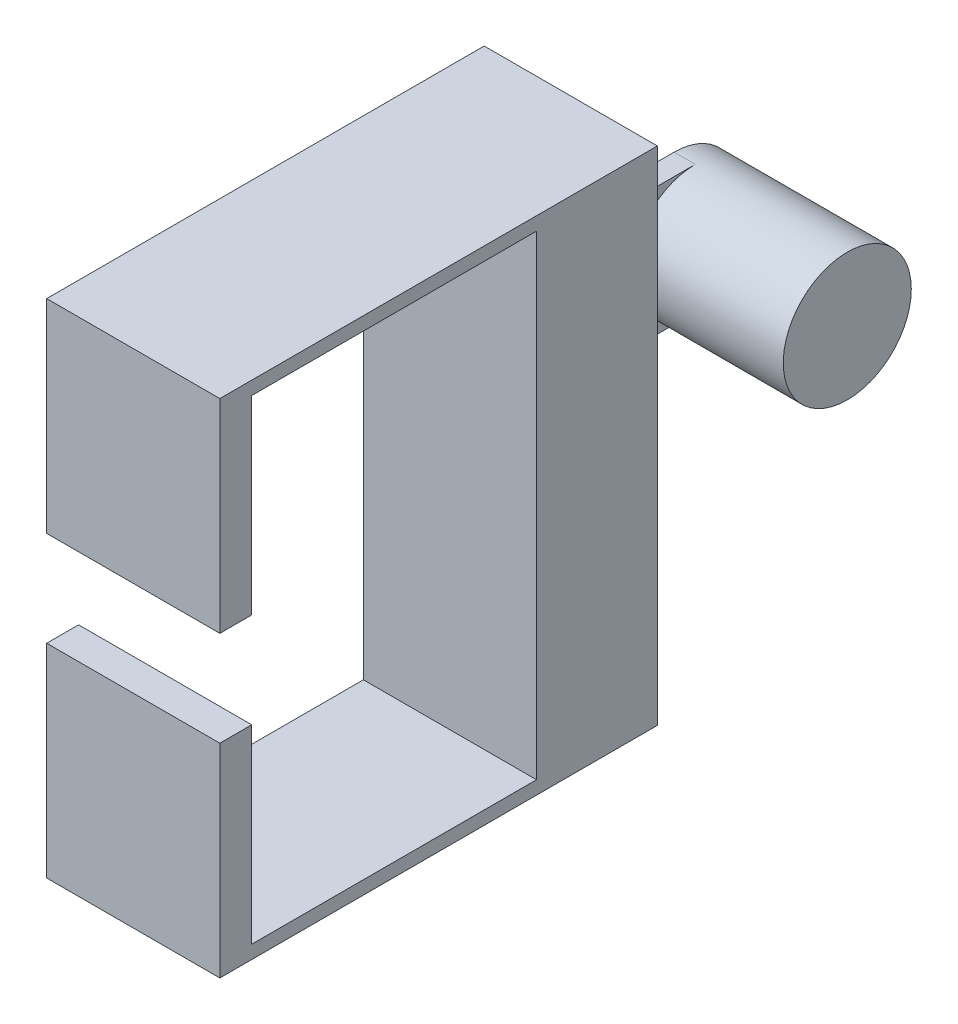
ISO-10303-21;
HEADER;
FILE_DESCRIPTION(('STEP AP214'),'2;1');
FILE_NAME('part.step','',(''),(''),'','','');
FILE_SCHEMA(('AUTOMOTIVE_DESIGN { 1 0 10303 214 1 1 1 1 }'));
ENDSEC;
DATA;
#1=APPLICATION_CONTEXT('core data for automotive mechanical design processes');
#2=APPLICATION_PROTOCOL_DEFINITION('international standard','automotive_design',2000,#1);
#3=PRODUCT_CONTEXT('',#1,'mechanical');
#4=PRODUCT('Part','Part','',(#3));
#5=PRODUCT_RELATED_PRODUCT_CATEGORY('part','',(#4));
#6=PRODUCT_DEFINITION_FORMATION('','',#4);
#7=PRODUCT_DEFINITION_CONTEXT('part definition',#1,'design');
#8=PRODUCT_DEFINITION('design','',#6,#7);
#9=PRODUCT_DEFINITION_SHAPE('','',#8);
#10=(LENGTH_UNIT() NAMED_UNIT(*) SI_UNIT(.MILLI.,.METRE.));
#11=(NAMED_UNIT(*) PLANE_ANGLE_UNIT() SI_UNIT($,.RADIAN.));
#12=(NAMED_UNIT(*) SI_UNIT($,.STERADIAN.) SOLID_ANGLE_UNIT());
#13=UNCERTAINTY_MEASURE_WITH_UNIT(LENGTH_MEASURE(1.E-05),#10,'distance_accuracy_value','');
#14=(GEOMETRIC_REPRESENTATION_CONTEXT(3) GLOBAL_UNCERTAINTY_ASSIGNED_CONTEXT((#13)) GLOBAL_UNIT_ASSIGNED_CONTEXT((#10,
#11,#12)) REPRESENTATION_CONTEXT('',''));
#15=CARTESIAN_POINT('',(0.,0.,0.));
#16=DIRECTION('',(0.,0.,1.));
#17=DIRECTION('',(1.,0.,0.));
#18=AXIS2_PLACEMENT_3D('',#15,#16,#17);
#19=CARTESIAN_POINT('',(20.32,0.,0.));
#20=DIRECTION('',(-1.,0.,0.));
#21=DIRECTION('',(0.,0.,1.));
#22=AXIS2_PLACEMENT_3D('',#19,#20,#21);
#23=CYLINDRICAL_SURFACE('',#22,8.56234917061049);
#24=CARTESIAN_POINT('',(20.32,0.,0.));
#25=DIRECTION('',(1.,0.,0.));
#26=DIRECTION('',(0.,0.,-1.));
#27=AXIS2_PLACEMENT_3D('',#24,#25,#26);
#28=CIRCLE('',#27,8.56234917061049);
#29=CARTESIAN_POINT('',(20.32,0.,-8.56234917061049));
#30=VERTEX_POINT('',#29);
#31=EDGE_CURVE('E14',#30,#30,#28,.T.);
#32=ORIENTED_EDGE('',*,*,#31,.F.);
#33=EDGE_LOOP('',(#32));
#34=FACE_BOUND('',#33,.T.);
#35=CARTESIAN_POINT('',(0.,0.,0.));
#36=DIRECTION('',(1.,0.,0.));
#37=DIRECTION('',(0.,0.,-1.));
#38=AXIS2_PLACEMENT_3D('',#35,#36,#37);
#39=CIRCLE('',#38,8.56234917061049);
#40=CARTESIAN_POINT('',(0.,8.56234917061049,0.));
#41=VERTEX_POINT('',#40);
#42=CARTESIAN_POINT('',(0.,-8.56234917061049,0.));
#43=VERTEX_POINT('',#42);
#44=EDGE_CURVE('E119',#41,#43,#39,.T.);
#45=ORIENTED_EDGE('',*,*,#44,.T.);
#46=DIRECTION('',(1.,0.,0.));
#47=VECTOR('',#46,1.);
#48=CARTESIAN_POINT('',(-2.83368809650338,-8.56234917061049,0.));
#49=LINE('',#48,#47);
#50=CARTESIAN_POINT('',(-2.83368809650338,-8.56234917061049,0.));
#51=VERTEX_POINT('',#50);
#52=EDGE_CURVE('E137',#51,#43,#49,.T.);
#53=ORIENTED_EDGE('',*,*,#52,.F.);
#54=CARTESIAN_POINT('',(-2.83368809650338,0.,0.));
#55=DIRECTION('',(1.,0.,0.));
#56=DIRECTION('',(0.,0.,-1.));
#57=AXIS2_PLACEMENT_3D('',#54,#55,#56);
#58=CIRCLE('',#57,8.56234917061049);
#59=CARTESIAN_POINT('',(-2.83368809650338,8.56234917061049,0.));
#60=VERTEX_POINT('',#59);
#61=EDGE_CURVE('E378',#51,#60,#58,.T.);
#62=ORIENTED_EDGE('',*,*,#61,.T.);
#63=DIRECTION('',(1.,0.,0.));
#64=VECTOR('',#63,1.);
#65=CARTESIAN_POINT('',(-2.83368809650338,8.56234917061049,0.));
#66=LINE('',#65,#64);
#67=EDGE_CURVE('E390',#60,#41,#66,.T.);
#68=ORIENTED_EDGE('',*,*,#67,.T.);
#69=EDGE_LOOP('',(#45,#53,#62,#68));
#70=FACE_BOUND('',#69,.T.);
#71=ADVANCED_FACE('F118',(#34,#70),#23,.T.);
#72=CARTESIAN_POINT('',(20.32,0.,0.));
#73=DIRECTION('',(1.,0.,0.));
#74=DIRECTION('',(0.,0.,-1.));
#75=AXIS2_PLACEMENT_3D('',#72,#73,#74);
#76=PLANE('',#75);
#77=ORIENTED_EDGE('',*,*,#31,.T.);
#78=EDGE_LOOP('',(#77));
#79=FACE_BOUND('',#78,.T.);
#80=ADVANCED_FACE('F514',(#79),#76,.T.);
#81=CARTESIAN_POINT('',(0.,0.,0.));
#82=DIRECTION('',(1.,0.,0.));
#83=DIRECTION('',(0.,0.,-1.));
#84=AXIS2_PLACEMENT_3D('',#81,#82,#83);
#85=PLANE('',#84);
#86=ORIENTED_EDGE('',*,*,#44,.F.);
#87=DIRECTION('',(0.,0.,-1.));
#88=VECTOR('',#87,1.);
#89=CARTESIAN_POINT('',(0.,8.56234917061049,0.));
#90=LINE('',#89,#88);
#91=CARTESIAN_POINT('',(0.,8.56234917061049,25.4));
#92=VERTEX_POINT('',#91);
#93=EDGE_CURVE('E133',#92,#41,#90,.T.);
#94=ORIENTED_EDGE('',*,*,#93,.F.);
#95=DIRECTION('',(0.,1.,0.));
#96=VECTOR('',#95,1.);
#97=CARTESIAN_POINT('',(0.,0.,25.4));
#98=LINE('',#97,#96);
#99=CARTESIAN_POINT('',(0.,-8.56234917061049,25.4));
#100=VERTEX_POINT('',#99);
#101=EDGE_CURVE('E388',#100,#92,#98,.T.);
#102=ORIENTED_EDGE('',*,*,#101,.F.);
#103=DIRECTION('',(0.,0.,-1.));
#104=VECTOR('',#103,1.);
#105=CARTESIAN_POINT('',(0.,-8.56234917061049,0.));
#106=LINE('',#105,#104);
#107=EDGE_CURVE('E381',#100,#43,#106,.T.);
#108=ORIENTED_EDGE('',*,*,#107,.T.);
#109=EDGE_LOOP('',(#86,#94,#102,#108));
#110=FACE_BOUND('',#109,.T.);
#111=ADVANCED_FACE('F409',(#110),#85,.T.);
#112=CARTESIAN_POINT('',(-2.83368809650338,-8.56234917061049,0.));
#113=DIRECTION('',(0.,-1.,0.));
#114=DIRECTION('',(0.,0.,-1.));
#115=AXIS2_PLACEMENT_3D('',#112,#113,#114);
#116=PLANE('',#115);
#117=ORIENTED_EDGE('',*,*,#107,.F.);
#118=DIRECTION('',(1.,0.,0.));
#119=VECTOR('',#118,1.);
#120=CARTESIAN_POINT('',(-2.83368809650338,-8.56234917061049,25.4));
#121=LINE('',#120,#119);
#122=CARTESIAN_POINT('',(-2.83368809650338,-8.56234917061049,25.4));
#123=VERTEX_POINT('',#122);
#124=EDGE_CURVE('E400',#123,#100,#121,.T.);
#125=ORIENTED_EDGE('',*,*,#124,.F.);
#126=DIRECTION('',(0.,0.,-1.));
#127=VECTOR('',#126,1.);
#128=CARTESIAN_POINT('',(-2.83368809650338,-8.56234917061049,0.));
#129=LINE('',#128,#127);
#130=EDGE_CURVE('E383',#123,#51,#129,.T.);
#131=ORIENTED_EDGE('',*,*,#130,.T.);
#132=ORIENTED_EDGE('',*,*,#52,.T.);
#133=EDGE_LOOP('',(#117,#125,#131,#132));
#134=FACE_BOUND('',#133,.T.);
#135=ADVANCED_FACE('F417',(#134),#116,.T.);
#136=CARTESIAN_POINT('',(-2.83368809650338,8.56234917061049,0.));
#137=DIRECTION('',(0.,-1.,0.));
#138=DIRECTION('',(0.,0.,-1.));
#139=AXIS2_PLACEMENT_3D('',#136,#137,#138);
#140=PLANE('',#139);
#141=ORIENTED_EDGE('',*,*,#93,.T.);
#142=ORIENTED_EDGE('',*,*,#67,.F.);
#143=DIRECTION('',(0.,0.,-1.));
#144=VECTOR('',#143,1.);
#145=CARTESIAN_POINT('',(-2.83368809650338,8.56234917061049,0.));
#146=LINE('',#145,#144);
#147=CARTESIAN_POINT('',(-2.83368809650338,8.56234917061049,25.4));
#148=VERTEX_POINT('',#147);
#149=EDGE_CURVE('E159',#148,#60,#146,.T.);
#150=ORIENTED_EDGE('',*,*,#149,.F.);
#151=DIRECTION('',(1.,0.,0.));
#152=VECTOR('',#151,1.);
#153=CARTESIAN_POINT('',(-2.83368809650338,8.56234917061049,25.4));
#154=LINE('',#153,#152);
#155=EDGE_CURVE('E405',#148,#92,#154,.T.);
#156=ORIENTED_EDGE('',*,*,#155,.T.);
#157=EDGE_LOOP('',(#141,#142,#150,#156));
#158=FACE_BOUND('',#157,.T.);
#159=ADVANCED_FACE('F528',(#158),#140,.F.);
#160=CARTESIAN_POINT('',(-2.83368809650338,0.,0.));
#161=DIRECTION('',(1.,0.,0.));
#162=DIRECTION('',(0.,0.,-1.));
#163=AXIS2_PLACEMENT_3D('',#160,#161,#162);
#164=PLANE('',#163);
#165=ORIENTED_EDGE('',*,*,#61,.F.);
#166=ORIENTED_EDGE('',*,*,#130,.F.);
#167=DIRECTION('',(0.,1.,0.));
#168=VECTOR('',#167,1.);
#169=CARTESIAN_POINT('',(-2.83368809650338,0.,25.4));
#170=LINE('',#169,#168);
#171=CARTESIAN_POINT('',(-2.83368809650338,-33.5541911532378,25.4));
#172=VERTEX_POINT('',#171);
#173=EDGE_CURVE('E302',#172,#123,#170,.T.);
#174=ORIENTED_EDGE('',*,*,#173,.F.);
#175=DIRECTION('',(0.,0.,-1.));
#176=VECTOR('',#175,1.);
#177=CARTESIAN_POINT('',(-2.83368809650338,-33.5541911532378,0.));
#178=LINE('',#177,#176);
#179=CARTESIAN_POINT('',(-2.83368809650338,-33.5541911532378,83.9097482997454));
#180=VERTEX_POINT('',#179);
#181=EDGE_CURVE('E248',#180,#172,#178,.T.);
#182=ORIENTED_EDGE('',*,*,#181,.F.);
#183=DIRECTION('',(0.,-1.,0.));
#184=VECTOR('',#183,1.);
#185=CARTESIAN_POINT('',(-2.83368809650338,0.,83.9097482997454));
#186=LINE('',#185,#184);
#187=CARTESIAN_POINT('',(-2.83368809650338,-6.36016,83.9097482997454));
#188=VERTEX_POINT('',#187);
#189=EDGE_CURVE('E339',#188,#180,#186,.T.);
#190=ORIENTED_EDGE('',*,*,#189,.F.);
#191=DIRECTION('',(0.,0.,-1.));
#192=VECTOR('',#191,1.);
#193=CARTESIAN_POINT('',(-2.83368809650338,-6.36015999999998,0.));
#194=LINE('',#193,#192);
#195=CARTESIAN_POINT('',(-2.83368809650338,-6.36016,79.6448861376298));
#196=VERTEX_POINT('',#195);
#197=EDGE_CURVE('E338',#188,#196,#194,.T.);
#198=ORIENTED_EDGE('',*,*,#197,.T.);
#199=DIRECTION('',(0.,-1.,0.));
#200=VECTOR('',#199,1.);
#201=CARTESIAN_POINT('',(-2.83368809650338,0.,79.6448861376298));
#202=LINE('',#201,#200);
#203=CARTESIAN_POINT('',(-2.83368809650338,-31.77032,79.6448861376298));
#204=VERTEX_POINT('',#203);
#205=EDGE_CURVE('E334',#196,#204,#202,.T.);
#206=ORIENTED_EDGE('',*,*,#205,.T.);
#207=DIRECTION('',(0.,0.,-1.));
#208=VECTOR('',#207,1.);
#209=CARTESIAN_POINT('',(-2.83368809650338,-31.77032,0.));
#210=LINE('',#209,#208);
#211=CARTESIAN_POINT('',(-2.83368809650338,-31.77032,41.5575861376298));
#212=VERTEX_POINT('',#211);
#213=EDGE_CURVE('E329',#204,#212,#210,.T.);
#214=ORIENTED_EDGE('',*,*,#213,.T.);
#215=DIRECTION('',(0.,1.,0.));
#216=VECTOR('',#215,1.);
#217=CARTESIAN_POINT('',(-2.83368809650338,0.,41.5575861376298));
#218=LINE('',#217,#216);
#219=CARTESIAN_POINT('',(-2.83368809650338,31.77032,41.5575861376298));
#220=VERTEX_POINT('',#219);
#221=EDGE_CURVE('E330',#212,#220,#218,.T.);
#222=ORIENTED_EDGE('',*,*,#221,.T.);
#223=DIRECTION('',(0.,0.,-1.));
#224=VECTOR('',#223,1.);
#225=CARTESIAN_POINT('',(-2.83368809650338,31.77032,0.));
#226=LINE('',#225,#224);
#227=CARTESIAN_POINT('',(-2.83368809650338,31.77032,79.6448861376298));
#228=VERTEX_POINT('',#227);
#229=EDGE_CURVE('E323',#228,#220,#226,.T.);
#230=ORIENTED_EDGE('',*,*,#229,.F.);
#231=DIRECTION('',(0.,1.,0.));
#232=VECTOR('',#231,1.);
#233=CARTESIAN_POINT('',(-2.83368809650338,0.,79.6448861376298));
#234=LINE('',#233,#232);
#235=CARTESIAN_POINT('',(-2.83368809650338,6.36016,79.6448861376298));
#236=VERTEX_POINT('',#235);
#237=EDGE_CURVE('E317',#236,#228,#234,.T.);
#238=ORIENTED_EDGE('',*,*,#237,.F.);
#239=DIRECTION('',(0.,0.,-1.));
#240=VECTOR('',#239,1.);
#241=CARTESIAN_POINT('',(-2.83368809650338,6.36015999999998,0.));
#242=LINE('',#241,#240);
#243=CARTESIAN_POINT('',(-2.83368809650338,6.36016,83.9097482997454));
#244=VERTEX_POINT('',#243);
#245=EDGE_CURVE('E312',#244,#236,#242,.T.);
#246=ORIENTED_EDGE('',*,*,#245,.F.);
#247=DIRECTION('',(0.,1.,0.));
#248=VECTOR('',#247,1.);
#249=CARTESIAN_POINT('',(-2.83368809650338,0.,83.9097482997454));
#250=LINE('',#249,#248);
#251=CARTESIAN_POINT('',(-2.83368809650338,33.5541911532378,83.9097482997454));
#252=VERTEX_POINT('',#251);
#253=EDGE_CURVE('E315',#244,#252,#250,.T.);
#254=ORIENTED_EDGE('',*,*,#253,.T.);
#255=DIRECTION('',(0.,0.,-1.));
#256=VECTOR('',#255,1.);
#257=CARTESIAN_POINT('',(-2.83368809650338,33.5541911532378,0.));
#258=LINE('',#257,#256);
#259=CARTESIAN_POINT('',(-2.83368809650338,33.5541911532378,25.4));
#260=VERTEX_POINT('',#259);
#261=EDGE_CURVE('E310',#252,#260,#258,.T.);
#262=ORIENTED_EDGE('',*,*,#261,.T.);
#263=EDGE_CURVE('E245',#148,#260,#170,.T.);
#264=ORIENTED_EDGE('',*,*,#263,.F.);
#265=ORIENTED_EDGE('',*,*,#149,.T.);
#266=EDGE_LOOP('',(#165,#166,#174,#182,#190,#198,#206,#214,#222,#230,#238,#246,#254,#262,#264,#265));
#267=FACE_BOUND('',#266,.T.);
#268=ADVANCED_FACE('F419',(#267),#164,.F.);
#269=CARTESIAN_POINT('',(-2.83368809650338,0.,25.4));
#270=DIRECTION('',(0.,0.,-1.));
#271=DIRECTION('',(0.,1.,0.));
#272=AXIS2_PLACEMENT_3D('',#269,#270,#271);
#273=PLANE('',#272);
#274=ORIENTED_EDGE('',*,*,#155,.F.);
#275=ORIENTED_EDGE('',*,*,#263,.T.);
#276=DIRECTION('',(1.,0.,0.));
#277=VECTOR('',#276,1.);
#278=CARTESIAN_POINT('',(-2.83368809650338,33.5541911532378,25.4));
#279=LINE('',#278,#277);
#280=CARTESIAN_POINT('',(20.32,33.5541911532378,25.4));
#281=VERTEX_POINT('',#280);
#282=EDGE_CURVE('E240',#260,#281,#279,.T.);
#283=ORIENTED_EDGE('',*,*,#282,.T.);
#284=DIRECTION('',(0.,1.,0.));
#285=VECTOR('',#284,1.);
#286=CARTESIAN_POINT('',(20.32,0.,25.4));
#287=LINE('',#286,#285);
#288=CARTESIAN_POINT('',(20.32,-33.5541911532378,25.4));
#289=VERTEX_POINT('',#288);
#290=EDGE_CURVE('E243',#289,#281,#287,.T.);
#291=ORIENTED_EDGE('',*,*,#290,.F.);
#292=DIRECTION('',(1.,0.,0.));
#293=VECTOR('',#292,1.);
#294=CARTESIAN_POINT('',(-2.83368809650338,-33.5541911532378,25.4));
#295=LINE('',#294,#293);
#296=EDGE_CURVE('E347',#172,#289,#295,.T.);
#297=ORIENTED_EDGE('',*,*,#296,.F.);
#298=ORIENTED_EDGE('',*,*,#173,.T.);
#299=ORIENTED_EDGE('',*,*,#124,.T.);
#300=ORIENTED_EDGE('',*,*,#101,.T.);
#301=EDGE_LOOP('',(#274,#275,#283,#291,#297,#298,#299,#300));
#302=FACE_BOUND('',#301,.T.);
#303=ADVANCED_FACE('F238',(#302),#273,.T.);
#304=CARTESIAN_POINT('',(-2.83368809650338,-33.5541911532378,0.));
#305=DIRECTION('',(0.,-1.,0.));
#306=DIRECTION('',(0.,0.,-1.));
#307=AXIS2_PLACEMENT_3D('',#304,#305,#306);
#308=PLANE('',#307);
#309=ORIENTED_EDGE('',*,*,#296,.T.);
#310=DIRECTION('',(0.,0.,-1.));
#311=VECTOR('',#310,1.);
#312=CARTESIAN_POINT('',(20.32,-33.5541911532378,0.));
#313=LINE('',#312,#311);
#314=CARTESIAN_POINT('',(20.32,-33.5541911532378,83.9097482997454));
#315=VERTEX_POINT('',#314);
#316=EDGE_CURVE('E257',#315,#289,#313,.T.);
#317=ORIENTED_EDGE('',*,*,#316,.F.);
#318=DIRECTION('',(1.,0.,0.));
#319=VECTOR('',#318,1.);
#320=CARTESIAN_POINT('',(-2.83368809650338,-33.5541911532378,83.9097482997454));
#321=LINE('',#320,#319);
#322=EDGE_CURVE('E349',#180,#315,#321,.T.);
#323=ORIENTED_EDGE('',*,*,#322,.F.);
#324=ORIENTED_EDGE('',*,*,#181,.T.);
#325=EDGE_LOOP('',(#309,#317,#323,#324));
#326=FACE_BOUND('',#325,.T.);
#327=ADVANCED_FACE('F421',(#326),#308,.T.);
#328=CARTESIAN_POINT('',(-2.83368809650338,0.,83.9097482997454));
#329=DIRECTION('',(0.,0.,1.));
#330=DIRECTION('',(1.,0.,0.));
#331=AXIS2_PLACEMENT_3D('',#328,#329,#330);
#332=PLANE('',#331);
#333=ORIENTED_EDGE('',*,*,#322,.T.);
#334=DIRECTION('',(0.,-1.,0.));
#335=VECTOR('',#334,1.);
#336=CARTESIAN_POINT('',(20.32,0.,83.9097482997454));
#337=LINE('',#336,#335);
#338=CARTESIAN_POINT('',(20.32,-6.36016,83.9097482997454));
#339=VERTEX_POINT('',#338);
#340=EDGE_CURVE('E297',#339,#315,#337,.T.);
#341=ORIENTED_EDGE('',*,*,#340,.F.);
#342=DIRECTION('',(1.,0.,0.));
#343=VECTOR('',#342,1.);
#344=CARTESIAN_POINT('',(-2.83368809650338,-6.36016,83.9097482997454));
#345=LINE('',#344,#343);
#346=EDGE_CURVE('E355',#188,#339,#345,.T.);
#347=ORIENTED_EDGE('',*,*,#346,.F.);
#348=ORIENTED_EDGE('',*,*,#189,.T.);
#349=EDGE_LOOP('',(#333,#341,#347,#348));
#350=FACE_BOUND('',#349,.T.);
#351=ADVANCED_FACE('F428',(#350),#332,.T.);
#352=CARTESIAN_POINT('',(-2.83368809650338,-6.36015999999998,0.));
#353=DIRECTION('',(0.,-1.,0.));
#354=DIRECTION('',(0.,0.,-1.));
#355=AXIS2_PLACEMENT_3D('',#352,#353,#354);
#356=PLANE('',#355);
#357=ORIENTED_EDGE('',*,*,#346,.T.);
#358=DIRECTION('',(0.,0.,-1.));
#359=VECTOR('',#358,1.);
#360=CARTESIAN_POINT('',(20.32,-6.36015999999998,0.));
#361=LINE('',#360,#359);
#362=CARTESIAN_POINT('',(20.32,-6.36016,79.6448861376298));
#363=VERTEX_POINT('',#362);
#364=EDGE_CURVE('E298',#339,#363,#361,.T.);
#365=ORIENTED_EDGE('',*,*,#364,.T.);
#366=DIRECTION('',(1.,0.,0.));
#367=VECTOR('',#366,1.);
#368=CARTESIAN_POINT('',(-2.83368809650338,-6.36016,79.6448861376298));
#369=LINE('',#368,#367);
#370=EDGE_CURVE('E352',#196,#363,#369,.T.);
#371=ORIENTED_EDGE('',*,*,#370,.F.);
#372=ORIENTED_EDGE('',*,*,#197,.F.);
#373=EDGE_LOOP('',(#357,#365,#371,#372));
#374=FACE_BOUND('',#373,.T.);
#375=ADVANCED_FACE('F435',(#374),#356,.F.);
#376=CARTESIAN_POINT('',(-2.83368809650338,0.,79.6448861376298));
#377=DIRECTION('',(0.,0.,1.));
#378=DIRECTION('',(0.,-1.,0.));
#379=AXIS2_PLACEMENT_3D('',#376,#377,#378);
#380=PLANE('',#379);
#381=ORIENTED_EDGE('',*,*,#370,.T.);
#382=DIRECTION('',(0.,-1.,0.));
#383=VECTOR('',#382,1.);
#384=CARTESIAN_POINT('',(20.32,0.,79.6448861376298));
#385=LINE('',#384,#383);
#386=CARTESIAN_POINT('',(20.32,-31.77032,79.6448861376298));
#387=VERTEX_POINT('',#386);
#388=EDGE_CURVE('E295',#363,#387,#385,.T.);
#389=ORIENTED_EDGE('',*,*,#388,.T.);
#390=DIRECTION('',(1.,0.,0.));
#391=VECTOR('',#390,1.);
#392=CARTESIAN_POINT('',(-2.83368809650338,-31.77032,79.6448861376298));
#393=LINE('',#392,#391);
#394=EDGE_CURVE('E360',#204,#387,#393,.T.);
#395=ORIENTED_EDGE('',*,*,#394,.F.);
#396=ORIENTED_EDGE('',*,*,#205,.F.);
#397=EDGE_LOOP('',(#381,#389,#395,#396));
#398=FACE_BOUND('',#397,.T.);
#399=ADVANCED_FACE('F440',(#398),#380,.F.);
#400=CARTESIAN_POINT('',(-2.83368809650338,-31.77032,0.));
#401=DIRECTION('',(0.,-1.,0.));
#402=DIRECTION('',(0.,0.,-1.));
#403=AXIS2_PLACEMENT_3D('',#400,#401,#402);
#404=PLANE('',#403);
#405=ORIENTED_EDGE('',*,*,#394,.T.);
#406=DIRECTION('',(0.,0.,-1.));
#407=VECTOR('',#406,1.);
#408=CARTESIAN_POINT('',(20.32,-31.77032,0.));
#409=LINE('',#408,#407);
#410=CARTESIAN_POINT('',(20.32,-31.77032,41.5575861376298));
#411=VERTEX_POINT('',#410);
#412=EDGE_CURVE('E290',#387,#411,#409,.T.);
#413=ORIENTED_EDGE('',*,*,#412,.T.);
#414=DIRECTION('',(1.,0.,0.));
#415=VECTOR('',#414,1.);
#416=CARTESIAN_POINT('',(-2.83368809650338,-31.77032,41.5575861376298));
#417=LINE('',#416,#415);
#418=EDGE_CURVE('E363',#212,#411,#417,.T.);
#419=ORIENTED_EDGE('',*,*,#418,.F.);
#420=ORIENTED_EDGE('',*,*,#213,.F.);
#421=EDGE_LOOP('',(#405,#413,#419,#420));
#422=FACE_BOUND('',#421,.T.);
#423=ADVANCED_FACE('F441',(#422),#404,.F.);
#424=CARTESIAN_POINT('',(-2.83368809650338,0.,41.5575861376298));
#425=DIRECTION('',(0.,0.,-1.));
#426=DIRECTION('',(-1.,0.,0.));
#427=AXIS2_PLACEMENT_3D('',#424,#425,#426);
#428=PLANE('',#427);
#429=ORIENTED_EDGE('',*,*,#418,.T.);
#430=DIRECTION('',(0.,1.,0.));
#431=VECTOR('',#430,1.);
#432=CARTESIAN_POINT('',(20.32,0.,41.5575861376298));
#433=LINE('',#432,#431);
#434=CARTESIAN_POINT('',(20.32,31.77032,41.5575861376298));
#435=VERTEX_POINT('',#434);
#436=EDGE_CURVE('E284',#411,#435,#433,.T.);
#437=ORIENTED_EDGE('',*,*,#436,.T.);
#438=DIRECTION('',(1.,0.,0.));
#439=VECTOR('',#438,1.);
#440=CARTESIAN_POINT('',(-2.83368809650338,31.77032,41.5575861376298));
#441=LINE('',#440,#439);
#442=EDGE_CURVE('E365',#220,#435,#441,.T.);
#443=ORIENTED_EDGE('',*,*,#442,.F.);
#444=ORIENTED_EDGE('',*,*,#221,.F.);
#445=EDGE_LOOP('',(#429,#437,#443,#444));
#446=FACE_BOUND('',#445,.T.);
#447=ADVANCED_FACE('F446',(#446),#428,.F.);
#448=CARTESIAN_POINT('',(-2.83368809650338,31.77032,0.));
#449=DIRECTION('',(0.,-1.,0.));
#450=DIRECTION('',(0.,0.,-1.));
#451=AXIS2_PLACEMENT_3D('',#448,#449,#450);
#452=PLANE('',#451);
#453=ORIENTED_EDGE('',*,*,#442,.T.);
#454=DIRECTION('',(0.,0.,-1.));
#455=VECTOR('',#454,1.);
#456=CARTESIAN_POINT('',(20.32,31.77032,0.));
#457=LINE('',#456,#455);
#458=CARTESIAN_POINT('',(20.32,31.77032,79.6448861376298));
#459=VERTEX_POINT('',#458);
#460=EDGE_CURVE('E278',#459,#435,#457,.T.);
#461=ORIENTED_EDGE('',*,*,#460,.F.);
#462=DIRECTION('',(1.,0.,0.));
#463=VECTOR('',#462,1.);
#464=CARTESIAN_POINT('',(-2.83368809650338,31.77032,79.6448861376298));
#465=LINE('',#464,#463);
#466=EDGE_CURVE('E370',#228,#459,#465,.T.);
#467=ORIENTED_EDGE('',*,*,#466,.F.);
#468=ORIENTED_EDGE('',*,*,#229,.T.);
#469=EDGE_LOOP('',(#453,#461,#467,#468));
#470=FACE_BOUND('',#469,.T.);
#471=ADVANCED_FACE('F454',(#470),#452,.T.);
#472=CARTESIAN_POINT('',(-2.83368809650338,0.,79.6448861376298));
#473=DIRECTION('',(0.,0.,-1.));
#474=DIRECTION('',(0.,1.,0.));
#475=AXIS2_PLACEMENT_3D('',#472,#473,#474);
#476=PLANE('',#475);
#477=ORIENTED_EDGE('',*,*,#466,.T.);
#478=DIRECTION('',(0.,1.,0.));
#479=VECTOR('',#478,1.);
#480=CARTESIAN_POINT('',(20.32,0.,79.6448861376298));
#481=LINE('',#480,#479);
#482=CARTESIAN_POINT('',(20.32,6.36016,79.6448861376298));
#483=VERTEX_POINT('',#482);
#484=EDGE_CURVE('E277',#483,#459,#481,.T.);
#485=ORIENTED_EDGE('',*,*,#484,.F.);
#486=DIRECTION('',(1.,0.,0.));
#487=VECTOR('',#486,1.);
#488=CARTESIAN_POINT('',(-2.83368809650338,6.36016,79.6448861376298));
#489=LINE('',#488,#487);
#490=EDGE_CURVE('E367',#236,#483,#489,.T.);
#491=ORIENTED_EDGE('',*,*,#490,.F.);
#492=ORIENTED_EDGE('',*,*,#237,.T.);
#493=EDGE_LOOP('',(#477,#485,#491,#492));
#494=FACE_BOUND('',#493,.T.);
#495=ADVANCED_FACE('F452',(#494),#476,.T.);
#496=CARTESIAN_POINT('',(-2.83368809650338,6.36015999999998,0.));
#497=DIRECTION('',(0.,-1.,0.));
#498=DIRECTION('',(0.,0.,-1.));
#499=AXIS2_PLACEMENT_3D('',#496,#497,#498);
#500=PLANE('',#499);
#501=ORIENTED_EDGE('',*,*,#490,.T.);
#502=DIRECTION('',(0.,0.,-1.));
#503=VECTOR('',#502,1.);
#504=CARTESIAN_POINT('',(20.32,6.36015999999998,0.));
#505=LINE('',#504,#503);
#506=CARTESIAN_POINT('',(20.32,6.36016,83.9097482997454));
#507=VERTEX_POINT('',#506);
#508=EDGE_CURVE('E269',#507,#483,#505,.T.);
#509=ORIENTED_EDGE('',*,*,#508,.F.);
#510=DIRECTION('',(1.,0.,0.));
#511=VECTOR('',#510,1.);
#512=CARTESIAN_POINT('',(-2.83368809650338,6.36016,83.9097482997454));
#513=LINE('',#512,#511);
#514=EDGE_CURVE('E373',#244,#507,#513,.T.);
#515=ORIENTED_EDGE('',*,*,#514,.F.);
#516=ORIENTED_EDGE('',*,*,#245,.T.);
#517=EDGE_LOOP('',(#501,#509,#515,#516));
#518=FACE_BOUND('',#517,.T.);
#519=ADVANCED_FACE('F459',(#518),#500,.T.);
#520=CARTESIAN_POINT('',(-2.83368809650338,0.,83.9097482997454));
#521=DIRECTION('',(0.,0.,-1.));
#522=DIRECTION('',(-1.,0.,0.));
#523=AXIS2_PLACEMENT_3D('',#520,#521,#522);
#524=PLANE('',#523);
#525=ORIENTED_EDGE('',*,*,#514,.T.);
#526=DIRECTION('',(0.,1.,0.));
#527=VECTOR('',#526,1.);
#528=CARTESIAN_POINT('',(20.32,0.,83.9097482997454));
#529=LINE('',#528,#527);
#530=CARTESIAN_POINT('',(20.32,33.5541911532378,83.9097482997454));
#531=VERTEX_POINT('',#530);
#532=EDGE_CURVE('E266',#507,#531,#529,.T.);
#533=ORIENTED_EDGE('',*,*,#532,.T.);
#534=DIRECTION('',(1.,0.,0.));
#535=VECTOR('',#534,1.);
#536=CARTESIAN_POINT('',(-2.83368809650338,33.5541911532378,83.9097482997454));
#537=LINE('',#536,#535);
#538=EDGE_CURVE('E250',#252,#531,#537,.T.);
#539=ORIENTED_EDGE('',*,*,#538,.F.);
#540=ORIENTED_EDGE('',*,*,#253,.F.);
#541=EDGE_LOOP('',(#525,#533,#539,#540));
#542=FACE_BOUND('',#541,.T.);
#543=ADVANCED_FACE('F463',(#542),#524,.F.);
#544=CARTESIAN_POINT('',(-2.83368809650338,33.5541911532378,0.));
#545=DIRECTION('',(0.,-1.,0.));
#546=DIRECTION('',(0.,0.,-1.));
#547=AXIS2_PLACEMENT_3D('',#544,#545,#546);
#548=PLANE('',#547);
#549=ORIENTED_EDGE('',*,*,#538,.T.);
#550=DIRECTION('',(0.,0.,-1.));
#551=VECTOR('',#550,1.);
#552=CARTESIAN_POINT('',(20.32,33.5541911532378,0.));
#553=LINE('',#552,#551);
#554=EDGE_CURVE('E258',#531,#281,#553,.T.);
#555=ORIENTED_EDGE('',*,*,#554,.T.);
#556=ORIENTED_EDGE('',*,*,#282,.F.);
#557=ORIENTED_EDGE('',*,*,#261,.F.);
#558=EDGE_LOOP('',(#549,#555,#556,#557));
#559=FACE_BOUND('',#558,.T.);
#560=ADVANCED_FACE('F263',(#559),#548,.F.);
#561=CARTESIAN_POINT('',(20.32,0.,0.));
#562=DIRECTION('',(1.,0.,0.));
#563=DIRECTION('',(0.,0.,-1.));
#564=AXIS2_PLACEMENT_3D('',#561,#562,#563);
#565=PLANE('',#564);
#566=ORIENTED_EDGE('',*,*,#290,.T.);
#567=ORIENTED_EDGE('',*,*,#554,.F.);
#568=ORIENTED_EDGE('',*,*,#532,.F.);
#569=ORIENTED_EDGE('',*,*,#508,.T.);
#570=ORIENTED_EDGE('',*,*,#484,.T.);
#571=ORIENTED_EDGE('',*,*,#460,.T.);
#572=ORIENTED_EDGE('',*,*,#436,.F.);
#573=ORIENTED_EDGE('',*,*,#412,.F.);
#574=ORIENTED_EDGE('',*,*,#388,.F.);
#575=ORIENTED_EDGE('',*,*,#364,.F.);
#576=ORIENTED_EDGE('',*,*,#340,.T.);
#577=ORIENTED_EDGE('',*,*,#316,.T.);
#578=EDGE_LOOP('',(#566,#567,#568,#569,#570,#571,#572,#573,#574,#575,#576,#577));
#579=FACE_BOUND('',#578,.T.);
#580=ADVANCED_FACE('F255',(#579),#565,.T.);
#581=CLOSED_SHELL('',(#71,#80,#111,#135,#159,#268,#303,#327,#351,#375,#399,#423,#447,#471,#495,
#519,#543,#560,#580));
#582=MANIFOLD_SOLID_BREP('B2',#581);
#583=ADVANCED_BREP_SHAPE_REPRESENTATION('',(#18,#582),#14);
#584=SHAPE_DEFINITION_REPRESENTATION(#9,#583);
ENDSEC;
END-ISO-10303-21;
